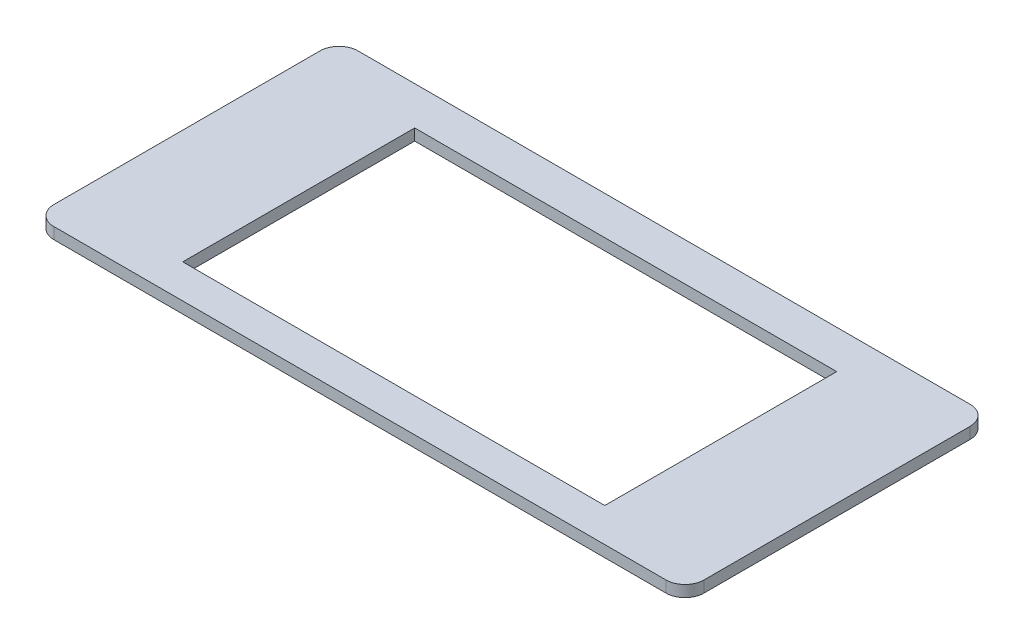
ISO-10303-21;
HEADER;
FILE_DESCRIPTION(('STEP AP214'),'2;1');
FILE_NAME('part.step','',(''),(''),'','','');
FILE_SCHEMA(('AUTOMOTIVE_DESIGN { 1 0 10303 214 1 1 1 1 }'));
ENDSEC;
DATA;
#1=APPLICATION_CONTEXT('core data for automotive mechanical design processes');
#2=APPLICATION_PROTOCOL_DEFINITION('international standard','automotive_design',2000,#1);
#3=PRODUCT_CONTEXT('',#1,'mechanical');
#4=PRODUCT('Part','Part','',(#3));
#5=PRODUCT_RELATED_PRODUCT_CATEGORY('part','',(#4));
#6=PRODUCT_DEFINITION_FORMATION('','',#4);
#7=PRODUCT_DEFINITION_CONTEXT('part definition',#1,'design');
#8=PRODUCT_DEFINITION('design','',#6,#7);
#9=PRODUCT_DEFINITION_SHAPE('','',#8);
#10=(LENGTH_UNIT() NAMED_UNIT(*) SI_UNIT(.MILLI.,.METRE.));
#11=(NAMED_UNIT(*) PLANE_ANGLE_UNIT() SI_UNIT($,.RADIAN.));
#12=(NAMED_UNIT(*) SI_UNIT($,.STERADIAN.) SOLID_ANGLE_UNIT());
#13=UNCERTAINTY_MEASURE_WITH_UNIT(LENGTH_MEASURE(1.E-05),#10,'distance_accuracy_value','');
#14=(GEOMETRIC_REPRESENTATION_CONTEXT(3) GLOBAL_UNCERTAINTY_ASSIGNED_CONTEXT((#13)) GLOBAL_UNIT_ASSIGNED_CONTEXT((#10,
#11,#12)) REPRESENTATION_CONTEXT('',''));
#15=CARTESIAN_POINT('',(0.,0.,0.));
#16=DIRECTION('',(0.,0.,1.));
#17=DIRECTION('',(1.,0.,0.));
#18=AXIS2_PLACEMENT_3D('',#15,#16,#17);
#19=CARTESIAN_POINT('',(-75.3612849946578,3.,-33.6023054755043));
#20=DIRECTION('',(0.,-1.,0.));
#21=DIRECTION('',(0.,0.,-1.));
#22=AXIS2_PLACEMENT_3D('',#19,#20,#21);
#23=PLANE('',#22);
#24=CARTESIAN_POINT('',(-75.3612849946578,3.,-33.6023054755043));
#25=DIRECTION('',(0.,1.,0.));
#26=DIRECTION('',(0.,0.,-1.));
#27=AXIS2_PLACEMENT_3D('',#24,#25,#26);
#28=CIRCLE('',#27,5.);
#29=CARTESIAN_POINT('',(-75.3612849946578,3.,-38.6023054755043));
#30=VERTEX_POINT('',#29);
#31=CARTESIAN_POINT('',(-80.3612849946578,3.,-33.6023054755043));
#32=VERTEX_POINT('',#31);
#33=EDGE_CURVE('E187',#30,#32,#28,.T.);
#34=ORIENTED_EDGE('',*,*,#33,.T.);
#35=DIRECTION('',(0.,0.,1.));
#36=VECTOR('',#35,1.);
#37=CARTESIAN_POINT('',(-80.3612849946578,3.,-33.6023054755043));
#38=LINE('',#37,#36);
#39=CARTESIAN_POINT('',(-80.3612849946578,3.,36.3976945244956));
#40=VERTEX_POINT('',#39);
#41=EDGE_CURVE('E228',#32,#40,#38,.T.);
#42=ORIENTED_EDGE('',*,*,#41,.T.);
#43=CARTESIAN_POINT('',(-75.3612849946578,3.,36.3976945244957));
#44=DIRECTION('',(0.,1.,0.));
#45=DIRECTION('',(0.,0.,-1.));
#46=AXIS2_PLACEMENT_3D('',#43,#44,#45);
#47=CIRCLE('',#46,5.);
#48=CARTESIAN_POINT('',(-75.3612849946578,3.,41.3976945244957));
#49=VERTEX_POINT('',#48);
#50=EDGE_CURVE('E225',#40,#49,#47,.T.);
#51=ORIENTED_EDGE('',*,*,#50,.T.);
#52=DIRECTION('',(1.,0.,0.));
#53=VECTOR('',#52,1.);
#54=CARTESIAN_POINT('',(-75.3612849946578,3.,41.3976945244957));
#55=LINE('',#54,#53);
#56=CARTESIAN_POINT('',(85.6387150053422,3.,41.3976945244957));
#57=VERTEX_POINT('',#56);
#58=EDGE_CURVE('E222',#49,#57,#55,.T.);
#59=ORIENTED_EDGE('',*,*,#58,.T.);
#60=CARTESIAN_POINT('',(85.6387150053422,3.,36.3976945244957));
#61=DIRECTION('',(0.,1.,0.));
#62=DIRECTION('',(0.,0.,1.));
#63=AXIS2_PLACEMENT_3D('',#60,#61,#62);
#64=CIRCLE('',#63,5.);
#65=CARTESIAN_POINT('',(90.6387150053422,3.,36.3976945244956));
#66=VERTEX_POINT('',#65);
#67=EDGE_CURVE('E219',#57,#66,#64,.T.);
#68=ORIENTED_EDGE('',*,*,#67,.T.);
#69=DIRECTION('',(0.,0.,-1.));
#70=VECTOR('',#69,1.);
#71=CARTESIAN_POINT('',(90.6387150053422,3.,-33.6023054755043));
#72=LINE('',#71,#70);
#73=CARTESIAN_POINT('',(90.6387150053422,3.,-33.6023054755043));
#74=VERTEX_POINT('',#73);
#75=EDGE_CURVE('E216',#66,#74,#72,.T.);
#76=ORIENTED_EDGE('',*,*,#75,.T.);
#77=CARTESIAN_POINT('',(85.6387150053422,3.,-33.6023054755043));
#78=DIRECTION('',(0.,1.,0.));
#79=DIRECTION('',(0.,0.,-1.));
#80=AXIS2_PLACEMENT_3D('',#77,#78,#79);
#81=CIRCLE('',#80,5.);
#82=CARTESIAN_POINT('',(85.6387150053422,3.,-38.6023054755043));
#83=VERTEX_POINT('',#82);
#84=EDGE_CURVE('E213',#74,#83,#81,.T.);
#85=ORIENTED_EDGE('',*,*,#84,.T.);
#86=DIRECTION('',(-1.,0.,0.));
#87=VECTOR('',#86,1.);
#88=CARTESIAN_POINT('',(-75.3612849946578,3.,-38.6023054755043));
#89=LINE('',#88,#87);
#90=EDGE_CURVE('E183',#83,#30,#89,.T.);
#91=ORIENTED_EDGE('',*,*,#90,.T.);
#92=EDGE_LOOP('',(#34,#42,#51,#59,#68,#76,#85,#91));
#93=FACE_BOUND('',#92,.T.);
#94=DIRECTION('',(0.,0.,1.));
#95=VECTOR('',#94,1.);
#96=CARTESIAN_POINT('',(-50.3612849946578,3.,-33.6023054755043));
#97=LINE('',#96,#95);
#98=CARTESIAN_POINT('',(-50.3612849946578,3.,-28.5058649589905));
#99=VERTEX_POINT('',#98);
#100=CARTESIAN_POINT('',(-50.3612849946578,3.,32.4941350410095));
#101=VERTEX_POINT('',#100);
#102=EDGE_CURVE('E210',#99,#101,#97,.T.);
#103=ORIENTED_EDGE('',*,*,#102,.F.);
#104=DIRECTION('',(-1.,0.,0.));
#105=VECTOR('',#104,1.);
#106=CARTESIAN_POINT('',(-75.3612849946578,3.,-28.5058649589905));
#107=LINE('',#106,#105);
#108=CARTESIAN_POINT('',(60.6387150053422,3.,-28.5058649589905));
#109=VERTEX_POINT('',#108);
#110=EDGE_CURVE('E241',#109,#99,#107,.T.);
#111=ORIENTED_EDGE('',*,*,#110,.F.);
#112=DIRECTION('',(0.,0.,-1.));
#113=VECTOR('',#112,1.);
#114=CARTESIAN_POINT('',(60.6387150053422,3.,-33.6023054755043));
#115=LINE('',#114,#113);
#116=CARTESIAN_POINT('',(60.6387150053422,3.,32.4941350410095));
#117=VERTEX_POINT('',#116);
#118=EDGE_CURVE('E141',#117,#109,#115,.T.);
#119=ORIENTED_EDGE('',*,*,#118,.F.);
#120=DIRECTION('',(1.,0.,0.));
#121=VECTOR('',#120,1.);
#122=CARTESIAN_POINT('',(-75.3612849946578,3.,32.4941350410095));
#123=LINE('',#122,#121);
#124=EDGE_CURVE('E236',#101,#117,#123,.T.);
#125=ORIENTED_EDGE('',*,*,#124,.F.);
#126=EDGE_LOOP('',(#103,#111,#119,#125));
#127=FACE_BOUND('',#126,.T.);
#128=ADVANCED_FACE('F41',(#93,#127),#23,.F.);
#129=CARTESIAN_POINT('',(-75.3612849946578,0.,-33.6023054755043));
#130=DIRECTION('',(0.,-1.,0.));
#131=DIRECTION('',(0.,0.,-1.));
#132=AXIS2_PLACEMENT_3D('',#129,#130,#131);
#133=PLANE('',#132);
#134=CARTESIAN_POINT('',(-75.3612849946578,0.,-33.6023054755043));
#135=DIRECTION('',(0.,1.,0.));
#136=DIRECTION('',(0.,0.,-1.));
#137=AXIS2_PLACEMENT_3D('',#134,#135,#136);
#138=CIRCLE('',#137,5.);
#139=CARTESIAN_POINT('',(-75.3612849946578,0.,-38.6023054755043));
#140=VERTEX_POINT('',#139);
#141=CARTESIAN_POINT('',(-80.3612849946578,0.,-33.6023054755043));
#142=VERTEX_POINT('',#141);
#143=EDGE_CURVE('E206',#140,#142,#138,.T.);
#144=ORIENTED_EDGE('',*,*,#143,.F.);
#145=DIRECTION('',(-1.,0.,0.));
#146=VECTOR('',#145,1.);
#147=CARTESIAN_POINT('',(-75.3612849946578,0.,-38.6023054755043));
#148=LINE('',#147,#146);
#149=CARTESIAN_POINT('',(85.6387150053422,0.,-38.6023054755043));
#150=VERTEX_POINT('',#149);
#151=EDGE_CURVE('E184',#150,#140,#148,.T.);
#152=ORIENTED_EDGE('',*,*,#151,.F.);
#153=CARTESIAN_POINT('',(85.6387150053422,0.,-33.6023054755043));
#154=DIRECTION('',(0.,1.,0.));
#155=DIRECTION('',(0.,0.,-1.));
#156=AXIS2_PLACEMENT_3D('',#153,#154,#155);
#157=CIRCLE('',#156,5.);
#158=CARTESIAN_POINT('',(90.6387150053422,0.,-33.6023054755043));
#159=VERTEX_POINT('',#158);
#160=EDGE_CURVE('E188',#159,#150,#157,.T.);
#161=ORIENTED_EDGE('',*,*,#160,.F.);
#162=DIRECTION('',(0.,0.,-1.));
#163=VECTOR('',#162,1.);
#164=CARTESIAN_POINT('',(90.6387150053422,0.,-33.6023054755043));
#165=LINE('',#164,#163);
#166=CARTESIAN_POINT('',(90.6387150053422,0.,36.3976945244956));
#167=VERTEX_POINT('',#166);
#168=EDGE_CURVE('E191',#167,#159,#165,.T.);
#169=ORIENTED_EDGE('',*,*,#168,.F.);
#170=CARTESIAN_POINT('',(85.6387150053422,0.,36.3976945244957));
#171=DIRECTION('',(0.,1.,0.));
#172=DIRECTION('',(0.,0.,1.));
#173=AXIS2_PLACEMENT_3D('',#170,#171,#172);
#174=CIRCLE('',#173,5.);
#175=CARTESIAN_POINT('',(85.6387150053422,0.,41.3976945244957));
#176=VERTEX_POINT('',#175);
#177=EDGE_CURVE('E194',#176,#167,#174,.T.);
#178=ORIENTED_EDGE('',*,*,#177,.F.);
#179=DIRECTION('',(1.,0.,0.));
#180=VECTOR('',#179,1.);
#181=CARTESIAN_POINT('',(-75.3612849946578,0.,41.3976945244957));
#182=LINE('',#181,#180);
#183=CARTESIAN_POINT('',(-75.3612849946578,0.,41.3976945244957));
#184=VERTEX_POINT('',#183);
#185=EDGE_CURVE('E197',#184,#176,#182,.T.);
#186=ORIENTED_EDGE('',*,*,#185,.F.);
#187=CARTESIAN_POINT('',(-75.3612849946578,0.,36.3976945244957));
#188=DIRECTION('',(0.,1.,0.));
#189=DIRECTION('',(0.,0.,-1.));
#190=AXIS2_PLACEMENT_3D('',#187,#188,#189);
#191=CIRCLE('',#190,5.);
#192=CARTESIAN_POINT('',(-80.3612849946578,0.,36.3976945244956));
#193=VERTEX_POINT('',#192);
#194=EDGE_CURVE('E200',#193,#184,#191,.T.);
#195=ORIENTED_EDGE('',*,*,#194,.F.);
#196=DIRECTION('',(0.,0.,1.));
#197=VECTOR('',#196,1.);
#198=CARTESIAN_POINT('',(-80.3612849946578,0.,-33.6023054755043));
#199=LINE('',#198,#197);
#200=EDGE_CURVE('E203',#142,#193,#199,.T.);
#201=ORIENTED_EDGE('',*,*,#200,.F.);
#202=EDGE_LOOP('',(#144,#152,#161,#169,#178,#186,#195,#201));
#203=FACE_BOUND('',#202,.T.);
#204=DIRECTION('',(-1.,0.,0.));
#205=VECTOR('',#204,1.);
#206=CARTESIAN_POINT('',(-75.3612849946578,0.,-28.5058649589905));
#207=LINE('',#206,#205);
#208=CARTESIAN_POINT('',(60.6387150053422,0.,-28.5058649589905));
#209=VERTEX_POINT('',#208);
#210=CARTESIAN_POINT('',(-50.3612849946578,0.,-28.5058649589905));
#211=VERTEX_POINT('',#210);
#212=EDGE_CURVE('E128',#209,#211,#207,.T.);
#213=ORIENTED_EDGE('',*,*,#212,.T.);
#214=DIRECTION('',(0.,0.,1.));
#215=VECTOR('',#214,1.);
#216=CARTESIAN_POINT('',(-50.3612849946578,0.,-33.6023054755043));
#217=LINE('',#216,#215);
#218=CARTESIAN_POINT('',(-50.3612849946578,0.,32.4941350410095));
#219=VERTEX_POINT('',#218);
#220=EDGE_CURVE('E11',#211,#219,#217,.T.);
#221=ORIENTED_EDGE('',*,*,#220,.T.);
#222=DIRECTION('',(1.,0.,0.));
#223=VECTOR('',#222,1.);
#224=CARTESIAN_POINT('',(-75.3612849946578,0.,32.4941350410095));
#225=LINE('',#224,#223);
#226=CARTESIAN_POINT('',(60.6387150053422,0.,32.4941350410095));
#227=VERTEX_POINT('',#226);
#228=EDGE_CURVE('E50',#219,#227,#225,.T.);
#229=ORIENTED_EDGE('',*,*,#228,.T.);
#230=DIRECTION('',(0.,0.,-1.));
#231=VECTOR('',#230,1.);
#232=CARTESIAN_POINT('',(60.6387150053422,0.,-33.6023054755043));
#233=LINE('',#232,#231);
#234=EDGE_CURVE('E133',#227,#209,#233,.T.);
#235=ORIENTED_EDGE('',*,*,#234,.T.);
#236=EDGE_LOOP('',(#213,#221,#229,#235));
#237=FACE_BOUND('',#236,.T.);
#238=ADVANCED_FACE('F147',(#203,#237),#133,.T.);
#239=CARTESIAN_POINT('',(-75.3612849946578,3.,-33.6023054755043));
#240=DIRECTION('',(0.,-1.,0.));
#241=DIRECTION('',(0.,0.,-1.));
#242=AXIS2_PLACEMENT_3D('',#239,#240,#241);
#243=CYLINDRICAL_SURFACE('',#242,5.);
#244=ORIENTED_EDGE('',*,*,#143,.T.);
#245=DIRECTION('',(0.,-1.,0.));
#246=VECTOR('',#245,1.);
#247=CARTESIAN_POINT('',(-80.3612849946578,3.,-33.6023054755043));
#248=LINE('',#247,#246);
#249=EDGE_CURVE('E134',#32,#142,#248,.T.);
#250=ORIENTED_EDGE('',*,*,#249,.F.);
#251=ORIENTED_EDGE('',*,*,#33,.F.);
#252=DIRECTION('',(0.,-1.,0.));
#253=VECTOR('',#252,1.);
#254=CARTESIAN_POINT('',(-75.3612849946578,3.,-38.6023054755043));
#255=LINE('',#254,#253);
#256=EDGE_CURVE('E179',#30,#140,#255,.T.);
#257=ORIENTED_EDGE('',*,*,#256,.T.);
#258=EDGE_LOOP('',(#244,#250,#251,#257));
#259=FACE_BOUND('',#258,.T.);
#260=ADVANCED_FACE('F43',(#259),#243,.T.);
#261=CARTESIAN_POINT('',(-80.3612849946578,3.,-33.6023054755043));
#262=DIRECTION('',(1.,0.,0.));
#263=DIRECTION('',(0.,0.,-1.));
#264=AXIS2_PLACEMENT_3D('',#261,#262,#263);
#265=PLANE('',#264);
#266=ORIENTED_EDGE('',*,*,#200,.T.);
#267=DIRECTION('',(0.,-1.,0.));
#268=VECTOR('',#267,1.);
#269=CARTESIAN_POINT('',(-80.3612849946578,3.,36.3976945244956));
#270=LINE('',#269,#268);
#271=EDGE_CURVE('E155',#40,#193,#270,.T.);
#272=ORIENTED_EDGE('',*,*,#271,.F.);
#273=ORIENTED_EDGE('',*,*,#41,.F.);
#274=ORIENTED_EDGE('',*,*,#249,.T.);
#275=EDGE_LOOP('',(#266,#272,#273,#274));
#276=FACE_BOUND('',#275,.T.);
#277=ADVANCED_FACE('F296',(#276),#265,.F.);
#278=CARTESIAN_POINT('',(-75.3612849946578,3.,36.3976945244957));
#279=DIRECTION('',(0.,-1.,0.));
#280=DIRECTION('',(0.,0.,-1.));
#281=AXIS2_PLACEMENT_3D('',#278,#279,#280);
#282=CYLINDRICAL_SURFACE('',#281,5.);
#283=ORIENTED_EDGE('',*,*,#194,.T.);
#284=DIRECTION('',(0.,-1.,0.));
#285=VECTOR('',#284,1.);
#286=CARTESIAN_POINT('',(-75.3612849946578,3.,41.3976945244957));
#287=LINE('',#286,#285);
#288=EDGE_CURVE('E159',#49,#184,#287,.T.);
#289=ORIENTED_EDGE('',*,*,#288,.F.);
#290=ORIENTED_EDGE('',*,*,#50,.F.);
#291=ORIENTED_EDGE('',*,*,#271,.T.);
#292=EDGE_LOOP('',(#283,#289,#290,#291));
#293=FACE_BOUND('',#292,.T.);
#294=ADVANCED_FACE('F293',(#293),#282,.T.);
#295=CARTESIAN_POINT('',(-75.3612849946578,3.,41.3976945244957));
#296=DIRECTION('',(0.,0.,-1.));
#297=DIRECTION('',(-1.,0.,0.));
#298=AXIS2_PLACEMENT_3D('',#295,#296,#297);
#299=PLANE('',#298);
#300=ORIENTED_EDGE('',*,*,#185,.T.);
#301=DIRECTION('',(0.,-1.,0.));
#302=VECTOR('',#301,1.);
#303=CARTESIAN_POINT('',(85.6387150053422,3.,41.3976945244957));
#304=LINE('',#303,#302);
#305=EDGE_CURVE('E163',#57,#176,#304,.T.);
#306=ORIENTED_EDGE('',*,*,#305,.F.);
#307=ORIENTED_EDGE('',*,*,#58,.F.);
#308=ORIENTED_EDGE('',*,*,#288,.T.);
#309=EDGE_LOOP('',(#300,#306,#307,#308));
#310=FACE_BOUND('',#309,.T.);
#311=ADVANCED_FACE('F289',(#310),#299,.F.);
#312=CARTESIAN_POINT('',(85.6387150053422,3.,36.3976945244957));
#313=DIRECTION('',(0.,-1.,0.));
#314=DIRECTION('',(0.,0.,-1.));
#315=AXIS2_PLACEMENT_3D('',#312,#313,#314);
#316=CYLINDRICAL_SURFACE('',#315,5.);
#317=ORIENTED_EDGE('',*,*,#177,.T.);
#318=DIRECTION('',(0.,-1.,0.));
#319=VECTOR('',#318,1.);
#320=CARTESIAN_POINT('',(90.6387150053422,3.,36.3976945244956));
#321=LINE('',#320,#319);
#322=EDGE_CURVE('E167',#66,#167,#321,.T.);
#323=ORIENTED_EDGE('',*,*,#322,.F.);
#324=ORIENTED_EDGE('',*,*,#67,.F.);
#325=ORIENTED_EDGE('',*,*,#305,.T.);
#326=EDGE_LOOP('',(#317,#323,#324,#325));
#327=FACE_BOUND('',#326,.T.);
#328=ADVANCED_FACE('F285',(#327),#316,.T.);
#329=CARTESIAN_POINT('',(90.6387150053422,3.,-33.6023054755043));
#330=DIRECTION('',(-1.,0.,0.));
#331=DIRECTION('',(0.,0.,1.));
#332=AXIS2_PLACEMENT_3D('',#329,#330,#331);
#333=PLANE('',#332);
#334=ORIENTED_EDGE('',*,*,#168,.T.);
#335=DIRECTION('',(0.,-1.,0.));
#336=VECTOR('',#335,1.);
#337=CARTESIAN_POINT('',(90.6387150053422,3.,-33.6023054755043));
#338=LINE('',#337,#336);
#339=EDGE_CURVE('E171',#74,#159,#338,.T.);
#340=ORIENTED_EDGE('',*,*,#339,.F.);
#341=ORIENTED_EDGE('',*,*,#75,.F.);
#342=ORIENTED_EDGE('',*,*,#322,.T.);
#343=EDGE_LOOP('',(#334,#340,#341,#342));
#344=FACE_BOUND('',#343,.T.);
#345=ADVANCED_FACE('F281',(#344),#333,.F.);
#346=CARTESIAN_POINT('',(85.6387150053422,3.,-33.6023054755043));
#347=DIRECTION('',(0.,-1.,0.));
#348=DIRECTION('',(0.,0.,-1.));
#349=AXIS2_PLACEMENT_3D('',#346,#347,#348);
#350=CYLINDRICAL_SURFACE('',#349,5.);
#351=ORIENTED_EDGE('',*,*,#160,.T.);
#352=DIRECTION('',(0.,-1.,0.));
#353=VECTOR('',#352,1.);
#354=CARTESIAN_POINT('',(85.6387150053422,3.,-38.6023054755043));
#355=LINE('',#354,#353);
#356=EDGE_CURVE('E175',#83,#150,#355,.T.);
#357=ORIENTED_EDGE('',*,*,#356,.F.);
#358=ORIENTED_EDGE('',*,*,#84,.F.);
#359=ORIENTED_EDGE('',*,*,#339,.T.);
#360=EDGE_LOOP('',(#351,#357,#358,#359));
#361=FACE_BOUND('',#360,.T.);
#362=ADVANCED_FACE('F267',(#361),#350,.T.);
#363=CARTESIAN_POINT('',(-75.3612849946578,3.,-38.6023054755043));
#364=DIRECTION('',(0.,0.,1.));
#365=DIRECTION('',(1.,0.,0.));
#366=AXIS2_PLACEMENT_3D('',#363,#364,#365);
#367=PLANE('',#366);
#368=ORIENTED_EDGE('',*,*,#151,.T.);
#369=ORIENTED_EDGE('',*,*,#256,.F.);
#370=ORIENTED_EDGE('',*,*,#90,.F.);
#371=ORIENTED_EDGE('',*,*,#356,.T.);
#372=EDGE_LOOP('',(#368,#369,#370,#371));
#373=FACE_BOUND('',#372,.T.);
#374=ADVANCED_FACE('F260',(#373),#367,.F.);
#375=CARTESIAN_POINT('',(-50.3612849946578,5.,-28.5058649589905));
#376=DIRECTION('',(1.,0.,0.));
#377=DIRECTION('',(0.,0.,-1.));
#378=AXIS2_PLACEMENT_3D('',#375,#376,#377);
#379=PLANE('',#378);
#380=ORIENTED_EDGE('',*,*,#102,.T.);
#381=DIRECTION('',(0.,-1.,0.));
#382=VECTOR('',#381,1.);
#383=CARTESIAN_POINT('',(-50.3612849946578,5.,32.4941350410095));
#384=LINE('',#383,#382);
#385=EDGE_CURVE('E244',#101,#219,#384,.T.);
#386=ORIENTED_EDGE('',*,*,#385,.T.);
#387=ORIENTED_EDGE('',*,*,#220,.F.);
#388=DIRECTION('',(0.,-1.,0.));
#389=VECTOR('',#388,1.);
#390=CARTESIAN_POINT('',(-50.3612849946578,5.,-28.5058649589905));
#391=LINE('',#390,#389);
#392=EDGE_CURVE('E62',#99,#211,#391,.T.);
#393=ORIENTED_EDGE('',*,*,#392,.F.);
#394=EDGE_LOOP('',(#380,#386,#387,#393));
#395=FACE_BOUND('',#394,.T.);
#396=ADVANCED_FACE('F258',(#395),#379,.T.);
#397=CARTESIAN_POINT('',(-50.3612849946578,5.,32.4941350410095));
#398=DIRECTION('',(0.,0.,-1.));
#399=DIRECTION('',(-1.,0.,0.));
#400=AXIS2_PLACEMENT_3D('',#397,#398,#399);
#401=PLANE('',#400);
#402=ORIENTED_EDGE('',*,*,#124,.T.);
#403=DIRECTION('',(0.,-1.,0.));
#404=VECTOR('',#403,1.);
#405=CARTESIAN_POINT('',(60.6387150053422,5.,32.4941350410095));
#406=LINE('',#405,#404);
#407=EDGE_CURVE('E144',#117,#227,#406,.T.);
#408=ORIENTED_EDGE('',*,*,#407,.T.);
#409=ORIENTED_EDGE('',*,*,#228,.F.);
#410=ORIENTED_EDGE('',*,*,#385,.F.);
#411=EDGE_LOOP('',(#402,#408,#409,#410));
#412=FACE_BOUND('',#411,.T.);
#413=ADVANCED_FACE('F252',(#412),#401,.T.);
#414=CARTESIAN_POINT('',(60.6387150053422,5.,-28.5058649589905));
#415=DIRECTION('',(-1.,0.,0.));
#416=DIRECTION('',(0.,0.,1.));
#417=AXIS2_PLACEMENT_3D('',#414,#415,#416);
#418=PLANE('',#417);
#419=ORIENTED_EDGE('',*,*,#118,.T.);
#420=DIRECTION('',(0.,-1.,0.));
#421=VECTOR('',#420,1.);
#422=CARTESIAN_POINT('',(60.6387150053422,5.,-28.5058649589905));
#423=LINE('',#422,#421);
#424=EDGE_CURVE('E57',#109,#209,#423,.T.);
#425=ORIENTED_EDGE('',*,*,#424,.T.);
#426=ORIENTED_EDGE('',*,*,#234,.F.);
#427=ORIENTED_EDGE('',*,*,#407,.F.);
#428=EDGE_LOOP('',(#419,#425,#426,#427));
#429=FACE_BOUND('',#428,.T.);
#430=ADVANCED_FACE('F137',(#429),#418,.T.);
#431=CARTESIAN_POINT('',(-50.3612849946578,5.,-28.5058649589905));
#432=DIRECTION('',(0.,0.,1.));
#433=DIRECTION('',(1.,0.,0.));
#434=AXIS2_PLACEMENT_3D('',#431,#432,#433);
#435=PLANE('',#434);
#436=ORIENTED_EDGE('',*,*,#110,.T.);
#437=ORIENTED_EDGE('',*,*,#392,.T.);
#438=ORIENTED_EDGE('',*,*,#212,.F.);
#439=ORIENTED_EDGE('',*,*,#424,.F.);
#440=EDGE_LOOP('',(#436,#437,#438,#439));
#441=FACE_BOUND('',#440,.T.);
#442=ADVANCED_FACE('F129',(#441),#435,.T.);
#443=CLOSED_SHELL('',(#128,#238,#260,#277,#294,#311,#328,#345,#362,#374,#396,#413,#430,#442));
#444=MANIFOLD_SOLID_BREP('B2',#443);
#445=ADVANCED_BREP_SHAPE_REPRESENTATION('',(#18,#444),#14);
#446=SHAPE_DEFINITION_REPRESENTATION(#9,#445);
ENDSEC;
END-ISO-10303-21;
